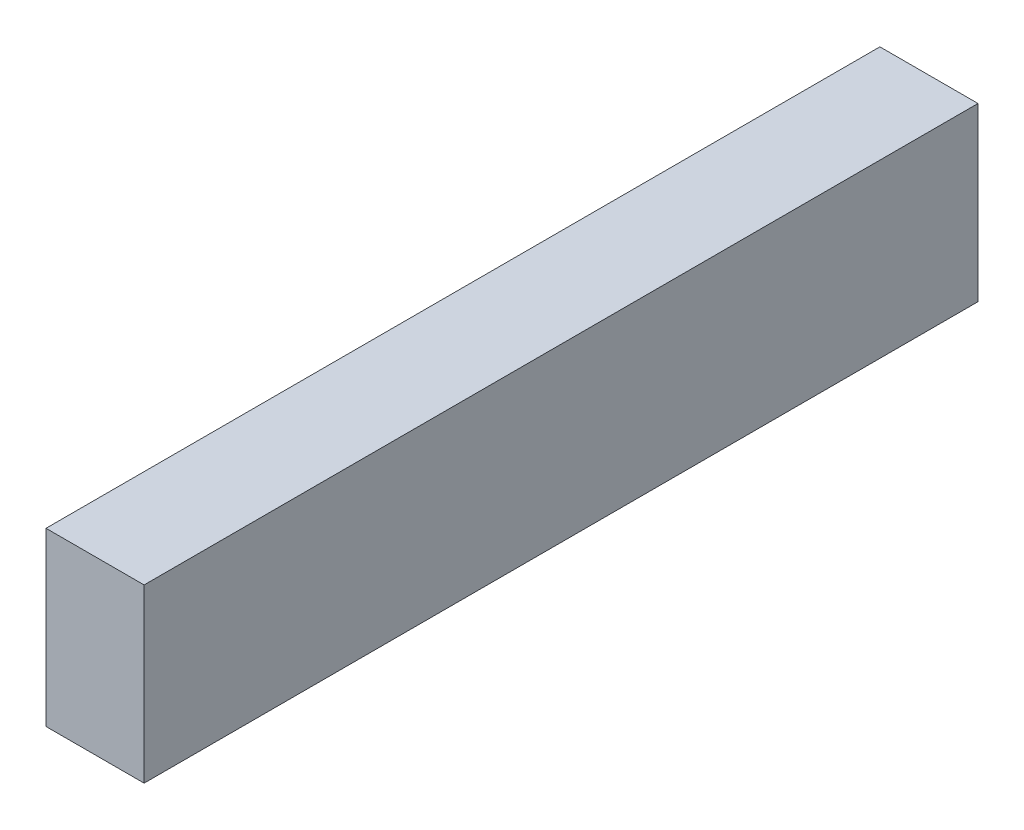
ISO-10303-21;
HEADER;
FILE_DESCRIPTION(('STEP AP214'),'2;1');
FILE_NAME('part.step','',(''),(''),'','','');
FILE_SCHEMA(('AUTOMOTIVE_DESIGN { 1 0 10303 214 1 1 1 1 }'));
ENDSEC;
DATA;
#1=APPLICATION_CONTEXT('core data for automotive mechanical design processes');
#2=APPLICATION_PROTOCOL_DEFINITION('international standard','automotive_design',2000,#1);
#3=PRODUCT_CONTEXT('',#1,'mechanical');
#4=PRODUCT('Part','Part','',(#3));
#5=PRODUCT_RELATED_PRODUCT_CATEGORY('part','',(#4));
#6=PRODUCT_DEFINITION_FORMATION('','',#4);
#7=PRODUCT_DEFINITION_CONTEXT('part definition',#1,'design');
#8=PRODUCT_DEFINITION('design','',#6,#7);
#9=PRODUCT_DEFINITION_SHAPE('','',#8);
#10=(LENGTH_UNIT() NAMED_UNIT(*) SI_UNIT(.MILLI.,.METRE.));
#11=(NAMED_UNIT(*) PLANE_ANGLE_UNIT() SI_UNIT($,.RADIAN.));
#12=(NAMED_UNIT(*) SI_UNIT($,.STERADIAN.) SOLID_ANGLE_UNIT());
#13=UNCERTAINTY_MEASURE_WITH_UNIT(LENGTH_MEASURE(1.E-05),#10,'distance_accuracy_value','');
#14=(GEOMETRIC_REPRESENTATION_CONTEXT(3) GLOBAL_UNCERTAINTY_ASSIGNED_CONTEXT((#13)) GLOBAL_UNIT_ASSIGNED_CONTEXT((#10,
#11,#12)) REPRESENTATION_CONTEXT('',''));
#15=CARTESIAN_POINT('',(0.,0.,0.));
#16=DIRECTION('',(0.,0.,1.));
#17=DIRECTION('',(1.,0.,0.));
#18=AXIS2_PLACEMENT_3D('',#15,#16,#17);
#19=CARTESIAN_POINT('',(0.,8.5,0.));
#20=DIRECTION('',(0.,1.,0.));
#21=DIRECTION('',(0.,0.,1.));
#22=AXIS2_PLACEMENT_3D('',#19,#20,#21);
#23=PLANE('',#22);
#24=DIRECTION('',(0.,0.,1.));
#25=VECTOR('',#24,1.);
#26=CARTESIAN_POINT('',(-0.420950420177317,8.5,-32.0094722230165));
#27=LINE('',#26,#25);
#28=CARTESIAN_POINT('',(-0.420950420177317,8.5,-32.0094722230165));
#29=VERTEX_POINT('',#28);
#30=CARTESIAN_POINT('',(-0.420950420177317,8.5,1.99052777698355));
#31=VERTEX_POINT('',#30);
#32=EDGE_CURVE('E107',#29,#31,#27,.T.);
#33=ORIENTED_EDGE('',*,*,#32,.T.);
#34=DIRECTION('',(1.,0.,0.));
#35=VECTOR('',#34,1.);
#36=CARTESIAN_POINT('',(-0.420950420177317,8.5,1.99052777698355));
#37=LINE('',#36,#35);
#38=CARTESIAN_POINT('',(3.57904957982269,8.5,1.99052777698355));
#39=VERTEX_POINT('',#38);
#40=EDGE_CURVE('E95',#31,#39,#37,.T.);
#41=ORIENTED_EDGE('',*,*,#40,.T.);
#42=DIRECTION('',(0.,0.,-1.));
#43=VECTOR('',#42,1.);
#44=CARTESIAN_POINT('',(3.57904957982268,8.5,-32.0094722230165));
#45=LINE('',#44,#43);
#46=CARTESIAN_POINT('',(3.57904957982268,8.5,-32.0094722230165));
#47=VERTEX_POINT('',#46);
#48=EDGE_CURVE('E115',#39,#47,#45,.T.);
#49=ORIENTED_EDGE('',*,*,#48,.T.);
#50=DIRECTION('',(-1.,0.,0.));
#51=VECTOR('',#50,1.);
#52=CARTESIAN_POINT('',(-0.420950420177317,8.5,-32.0094722230165));
#53=LINE('',#52,#51);
#54=EDGE_CURVE('E61',#47,#29,#53,.T.);
#55=ORIENTED_EDGE('',*,*,#54,.T.);
#56=EDGE_LOOP('',(#33,#41,#49,#55));
#57=FACE_BOUND('',#56,.T.);
#58=ADVANCED_FACE('F45',(#57),#23,.T.);
#59=CARTESIAN_POINT('',(3.57904957982268,8.5,-32.0094722230165));
#60=DIRECTION('',(-1.,0.,0.));
#61=DIRECTION('',(0.,0.,1.));
#62=AXIS2_PLACEMENT_3D('',#59,#60,#61);
#63=PLANE('',#62);
#64=DIRECTION('',(0.,0.,-1.));
#65=VECTOR('',#64,1.);
#66=CARTESIAN_POINT('',(3.57904957982268,1.5,-32.0094722230165));
#67=LINE('',#66,#65);
#68=CARTESIAN_POINT('',(3.57904957982269,1.5,1.99052777698355));
#69=VERTEX_POINT('',#68);
#70=CARTESIAN_POINT('',(3.57904957982268,1.5,-32.0094722230165));
#71=VERTEX_POINT('',#70);
#72=EDGE_CURVE('E88',#69,#71,#67,.T.);
#73=ORIENTED_EDGE('',*,*,#72,.T.);
#74=DIRECTION('',(0.,-1.,0.));
#75=VECTOR('',#74,1.);
#76=CARTESIAN_POINT('',(3.57904957982268,8.5,-32.0094722230165));
#77=LINE('',#76,#75);
#78=EDGE_CURVE('E109',#47,#71,#77,.T.);
#79=ORIENTED_EDGE('',*,*,#78,.F.);
#80=ORIENTED_EDGE('',*,*,#48,.F.);
#81=DIRECTION('',(0.,-1.,0.));
#82=VECTOR('',#81,1.);
#83=CARTESIAN_POINT('',(3.57904957982269,8.5,1.99052777698355));
#84=LINE('',#83,#82);
#85=EDGE_CURVE('E54',#39,#69,#84,.T.);
#86=ORIENTED_EDGE('',*,*,#85,.T.);
#87=EDGE_LOOP('',(#73,#79,#80,#86));
#88=FACE_BOUND('',#87,.T.);
#89=ADVANCED_FACE('F113',(#88),#63,.F.);
#90=CARTESIAN_POINT('',(-0.420950420177317,8.5,-32.0094722230165));
#91=DIRECTION('',(0.,0.,1.));
#92=DIRECTION('',(1.,0.,0.));
#93=AXIS2_PLACEMENT_3D('',#90,#91,#92);
#94=PLANE('',#93);
#95=DIRECTION('',(-1.,0.,0.));
#96=VECTOR('',#95,1.);
#97=CARTESIAN_POINT('',(-0.420950420177317,1.5,-32.0094722230165));
#98=LINE('',#97,#96);
#99=CARTESIAN_POINT('',(-0.420950420177317,1.5,-32.0094722230165));
#100=VERTEX_POINT('',#99);
#101=EDGE_CURVE('E105',#71,#100,#98,.T.);
#102=ORIENTED_EDGE('',*,*,#101,.T.);
#103=DIRECTION('',(0.,-1.,0.));
#104=VECTOR('',#103,1.);
#105=CARTESIAN_POINT('',(-0.420950420177317,8.5,-32.0094722230165));
#106=LINE('',#105,#104);
#107=EDGE_CURVE('E99',#29,#100,#106,.T.);
#108=ORIENTED_EDGE('',*,*,#107,.F.);
#109=ORIENTED_EDGE('',*,*,#54,.F.);
#110=ORIENTED_EDGE('',*,*,#78,.T.);
#111=EDGE_LOOP('',(#102,#108,#109,#110));
#112=FACE_BOUND('',#111,.T.);
#113=ADVANCED_FACE('F123',(#112),#94,.F.);
#114=CARTESIAN_POINT('',(-0.420950420177317,8.5,-32.0094722230165));
#115=DIRECTION('',(1.,0.,0.));
#116=DIRECTION('',(0.,0.,-1.));
#117=AXIS2_PLACEMENT_3D('',#114,#115,#116);
#118=PLANE('',#117);
#119=DIRECTION('',(0.,0.,1.));
#120=VECTOR('',#119,1.);
#121=CARTESIAN_POINT('',(-0.420950420177317,1.5,-32.0094722230165));
#122=LINE('',#121,#120);
#123=CARTESIAN_POINT('',(-0.420950420177317,1.5,1.99052777698355));
#124=VERTEX_POINT('',#123);
#125=EDGE_CURVE('E85',#100,#124,#122,.T.);
#126=ORIENTED_EDGE('',*,*,#125,.T.);
#127=DIRECTION('',(0.,-1.,0.));
#128=VECTOR('',#127,1.);
#129=CARTESIAN_POINT('',(-0.420950420177317,8.5,1.99052777698355));
#130=LINE('',#129,#128);
#131=EDGE_CURVE('E11',#31,#124,#130,.T.);
#132=ORIENTED_EDGE('',*,*,#131,.F.);
#133=ORIENTED_EDGE('',*,*,#32,.F.);
#134=ORIENTED_EDGE('',*,*,#107,.T.);
#135=EDGE_LOOP('',(#126,#132,#133,#134));
#136=FACE_BOUND('',#135,.T.);
#137=ADVANCED_FACE('F47',(#136),#118,.F.);
#138=CARTESIAN_POINT('',(-0.420950420177317,8.5,1.99052777698355));
#139=DIRECTION('',(0.,0.,-1.));
#140=DIRECTION('',(-1.,0.,0.));
#141=AXIS2_PLACEMENT_3D('',#138,#139,#140);
#142=PLANE('',#141);
#143=DIRECTION('',(1.,0.,0.));
#144=VECTOR('',#143,1.);
#145=CARTESIAN_POINT('',(-0.420950420177317,1.5,1.99052777698355));
#146=LINE('',#145,#144);
#147=EDGE_CURVE('E82',#124,#69,#146,.T.);
#148=ORIENTED_EDGE('',*,*,#147,.T.);
#149=ORIENTED_EDGE('',*,*,#85,.F.);
#150=ORIENTED_EDGE('',*,*,#40,.F.);
#151=ORIENTED_EDGE('',*,*,#131,.T.);
#152=EDGE_LOOP('',(#148,#149,#150,#151));
#153=FACE_BOUND('',#152,.T.);
#154=ADVANCED_FACE('F94',(#153),#142,.F.);
#155=CARTESIAN_POINT('',(-5.61531206408481,1.5,2.82592305837907));
#156=DIRECTION('',(0.,1.,0.));
#157=DIRECTION('',(0.,0.,1.));
#158=AXIS2_PLACEMENT_3D('',#155,#156,#157);
#159=PLANE('',#158);
#160=ORIENTED_EDGE('',*,*,#147,.F.);
#161=ORIENTED_EDGE('',*,*,#125,.F.);
#162=ORIENTED_EDGE('',*,*,#101,.F.);
#163=ORIENTED_EDGE('',*,*,#72,.F.);
#164=EDGE_LOOP('',(#160,#161,#162,#163));
#165=FACE_BOUND('',#164,.T.);
#166=ADVANCED_FACE('F83',(#165),#159,.F.);
#167=CLOSED_SHELL('',(#58,#89,#113,#137,#154,#166));
#168=MANIFOLD_SOLID_BREP('B2',#167);
#169=ADVANCED_BREP_SHAPE_REPRESENTATION('',(#18,#168),#14);
#170=SHAPE_DEFINITION_REPRESENTATION(#9,#169);
ENDSEC;
END-ISO-10303-21;
